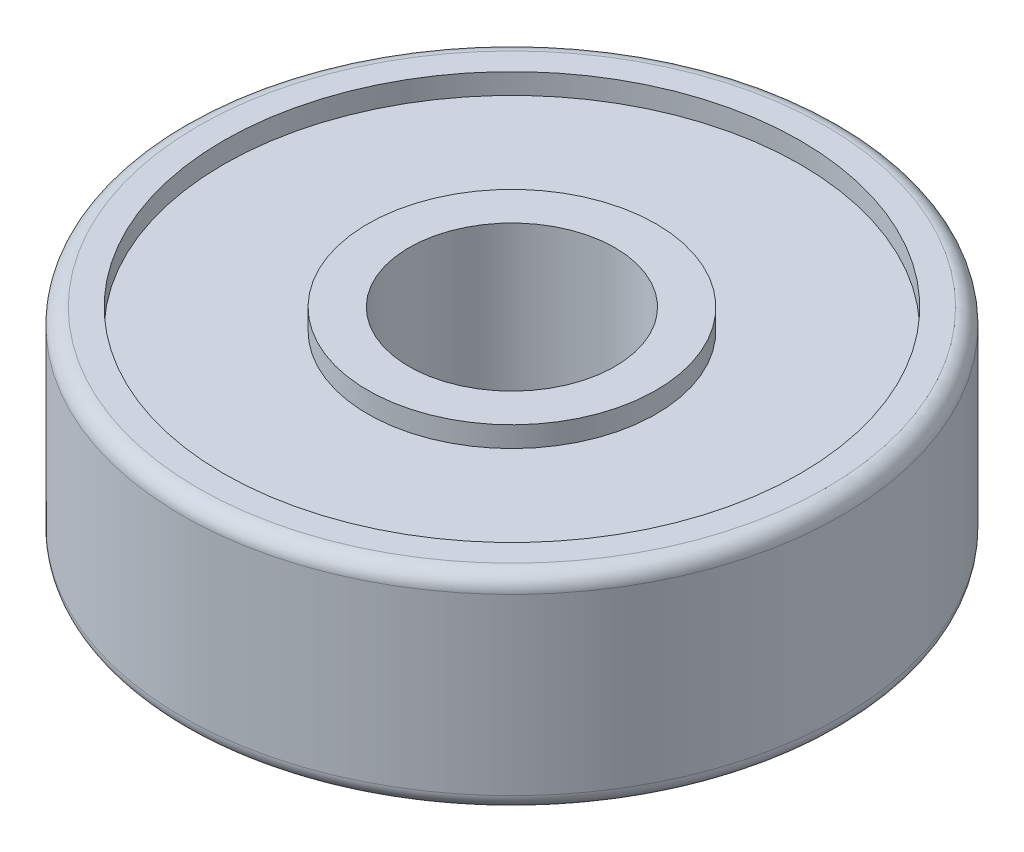
ISO-10303-21;
HEADER;
FILE_DESCRIPTION(('STEP AP214'),'2;1');
FILE_NAME('part.step','',(''),(''),'','','');
FILE_SCHEMA(('AUTOMOTIVE_DESIGN { 1 0 10303 214 1 1 1 1 }'));
ENDSEC;
DATA;
#1=APPLICATION_CONTEXT('core data for automotive mechanical design processes');
#2=APPLICATION_PROTOCOL_DEFINITION('international standard','automotive_design',2000,#1);
#3=PRODUCT_CONTEXT('',#1,'mechanical');
#4=PRODUCT('Part','Part','',(#3));
#5=PRODUCT_RELATED_PRODUCT_CATEGORY('part','',(#4));
#6=PRODUCT_DEFINITION_FORMATION('','',#4);
#7=PRODUCT_DEFINITION_CONTEXT('part definition',#1,'design');
#8=PRODUCT_DEFINITION('design','',#6,#7);
#9=PRODUCT_DEFINITION_SHAPE('','',#8);
#10=(LENGTH_UNIT() NAMED_UNIT(*) SI_UNIT(.MILLI.,.METRE.));
#11=(NAMED_UNIT(*) PLANE_ANGLE_UNIT() SI_UNIT($,.RADIAN.));
#12=(NAMED_UNIT(*) SI_UNIT($,.STERADIAN.) SOLID_ANGLE_UNIT());
#13=UNCERTAINTY_MEASURE_WITH_UNIT(LENGTH_MEASURE(1.E-05),#10,'distance_accuracy_value','');
#14=(GEOMETRIC_REPRESENTATION_CONTEXT(3) GLOBAL_UNCERTAINTY_ASSIGNED_CONTEXT((#13)) GLOBAL_UNIT_ASSIGNED_CONTEXT((#10,
#11,#12)) REPRESENTATION_CONTEXT('',''));
#15=CARTESIAN_POINT('',(0.,0.,0.));
#16=DIRECTION('',(0.,0.,1.));
#17=DIRECTION('',(1.,0.,0.));
#18=AXIS2_PLACEMENT_3D('',#15,#16,#17);
#19=CARTESIAN_POINT('',(0.,2.5,0.));
#20=DIRECTION('',(0.,-1.,0.));
#21=DIRECTION('',(0.,0.,-1.));
#22=AXIS2_PLACEMENT_3D('',#19,#20,#21);
#23=PLANE('',#22);
#24=CARTESIAN_POINT('',(0.,2.5,0.));
#25=DIRECTION('',(0.,-1.,0.));
#26=DIRECTION('',(0.,0.,-1.));
#27=AXIS2_PLACEMENT_3D('',#24,#25,#26);
#28=CIRCLE('',#27,7.);
#29=CARTESIAN_POINT('',(0.,2.5,-7.));
#30=VERTEX_POINT('',#29);
#31=EDGE_CURVE('E67',#30,#30,#28,.T.);
#32=ORIENTED_EDGE('',*,*,#31,.T.);
#33=EDGE_LOOP('',(#32));
#34=FACE_BOUND('',#33,.T.);
#35=CARTESIAN_POINT('',(0.,2.5,0.));
#36=DIRECTION('',(0.,-1.,0.));
#37=DIRECTION('',(1.,0.,0.));
#38=AXIS2_PLACEMENT_3D('',#35,#36,#37);
#39=CIRCLE('',#38,7.615);
#40=CARTESIAN_POINT('',(7.615,2.5,0.));
#41=VERTEX_POINT('',#40);
#42=CARTESIAN_POINT('',(0.,2.5,7.615));
#43=VERTEX_POINT('',#42);
#44=EDGE_CURVE('E52',#41,#43,#39,.T.);
#45=ORIENTED_EDGE('',*,*,#44,.F.);
#46=CARTESIAN_POINT('',(0.,2.5,0.));
#47=DIRECTION('',(0.,-1.,0.));
#48=DIRECTION('',(0.,0.,-1.));
#49=AXIS2_PLACEMENT_3D('',#46,#47,#48);
#50=CIRCLE('',#49,7.615);
#51=CARTESIAN_POINT('',(0.,2.5,-7.615));
#52=VERTEX_POINT('',#51);
#53=EDGE_CURVE('E55',#52,#41,#50,.T.);
#54=ORIENTED_EDGE('',*,*,#53,.F.);
#55=CARTESIAN_POINT('',(0.,2.5,0.));
#56=DIRECTION('',(0.,-1.,0.));
#57=DIRECTION('',(0.,0.,1.));
#58=AXIS2_PLACEMENT_3D('',#55,#56,#57);
#59=CIRCLE('',#58,7.615);
#60=EDGE_CURVE('E58',#43,#52,#59,.T.);
#61=ORIENTED_EDGE('',*,*,#60,.F.);
#62=EDGE_LOOP('',(#45,#54,#61));
#63=FACE_BOUND('',#62,.T.);
#64=ADVANCED_FACE('F17',(#34,#63),#23,.F.);
#65=CARTESIAN_POINT('',(0.,2.75,0.));
#66=DIRECTION('',(0.,-1.,0.));
#67=DIRECTION('',(0.,0.,-1.));
#68=AXIS2_PLACEMENT_3D('',#65,#66,#67);
#69=CYLINDRICAL_SURFACE('',#68,7.);
#70=CARTESIAN_POINT('',(0.,2.,0.));
#71=DIRECTION('',(0.,-1.,0.));
#72=DIRECTION('',(0.,0.,-1.));
#73=AXIS2_PLACEMENT_3D('',#70,#71,#72);
#74=CIRCLE('',#73,7.);
#75=CARTESIAN_POINT('',(0.,2.,-7.));
#76=VERTEX_POINT('',#75);
#77=EDGE_CURVE('E98',#76,#76,#74,.T.);
#78=ORIENTED_EDGE('',*,*,#77,.T.);
#79=EDGE_LOOP('',(#78));
#80=FACE_BOUND('',#79,.T.);
#81=ORIENTED_EDGE('',*,*,#31,.F.);
#82=EDGE_LOOP('',(#81));
#83=FACE_BOUND('',#82,.T.);
#84=ADVANCED_FACE('F87',(#80,#83),#69,.F.);
#85=CARTESIAN_POINT('',(0.,2.115,0.));
#86=DIRECTION('',(0.,-1.,0.));
#87=DIRECTION('',(0.,0.,-1.));
#88=AXIS2_PLACEMENT_3D('',#85,#86,#87);
#89=TOROIDAL_SURFACE('',#88,7.615,0.385);
#90=ORIENTED_EDGE('',*,*,#44,.T.);
#91=ORIENTED_EDGE('',*,*,#60,.T.);
#92=ORIENTED_EDGE('',*,*,#53,.T.);
#93=EDGE_LOOP('',(#90,#91,#92));
#94=FACE_BOUND('',#93,.T.);
#95=CARTESIAN_POINT('',(0.,2.115,0.));
#96=DIRECTION('',(0.,-1.,0.));
#97=DIRECTION('',(0.,0.,-1.));
#98=AXIS2_PLACEMENT_3D('',#95,#96,#97);
#99=CIRCLE('',#98,8.);
#100=CARTESIAN_POINT('',(0.,2.115,-8.));
#101=VERTEX_POINT('',#100);
#102=EDGE_CURVE('E95',#101,#101,#99,.T.);
#103=ORIENTED_EDGE('',*,*,#102,.F.);
#104=EDGE_LOOP('',(#103));
#105=FACE_BOUND('',#104,.T.);
#106=ADVANCED_FACE('F65',(#94,#105),#89,.T.);
#107=CARTESIAN_POINT('',(0.,2.,0.));
#108=DIRECTION('',(0.,-1.,0.));
#109=DIRECTION('',(0.,0.,-1.));
#110=AXIS2_PLACEMENT_3D('',#107,#108,#109);
#111=PLANE('',#110);
#112=CARTESIAN_POINT('',(0.,2.,0.));
#113=DIRECTION('',(0.,-1.,0.));
#114=DIRECTION('',(0.,0.,-1.));
#115=AXIS2_PLACEMENT_3D('',#112,#113,#114);
#116=CIRCLE('',#115,3.5);
#117=CARTESIAN_POINT('',(0.,2.,-3.5));
#118=VERTEX_POINT('',#117);
#119=EDGE_CURVE('E97',#118,#118,#116,.F.);
#120=ORIENTED_EDGE('',*,*,#119,.F.);
#121=EDGE_LOOP('',(#120));
#122=FACE_BOUND('',#121,.T.);
#123=ORIENTED_EDGE('',*,*,#77,.F.);
#124=EDGE_LOOP('',(#123));
#125=FACE_BOUND('',#124,.T.);
#126=ADVANCED_FACE('F86',(#122,#125),#111,.F.);
#127=CARTESIAN_POINT('',(0.,2.75,0.));
#128=DIRECTION('',(0.,-1.,0.));
#129=DIRECTION('',(0.,0.,-1.));
#130=AXIS2_PLACEMENT_3D('',#127,#128,#129);
#131=CYLINDRICAL_SURFACE('',#130,8.);
#132=CARTESIAN_POINT('',(0.,-2.115,0.));
#133=DIRECTION('',(0.,-1.,0.));
#134=DIRECTION('',(0.,0.,-1.));
#135=AXIS2_PLACEMENT_3D('',#132,#133,#134);
#136=CIRCLE('',#135,8.);
#137=CARTESIAN_POINT('',(0.,-2.115,-8.));
#138=VERTEX_POINT('',#137);
#139=EDGE_CURVE('E93',#138,#138,#136,.T.);
#140=ORIENTED_EDGE('',*,*,#139,.F.);
#141=EDGE_LOOP('',(#140));
#142=FACE_BOUND('',#141,.T.);
#143=ORIENTED_EDGE('',*,*,#102,.T.);
#144=EDGE_LOOP('',(#143));
#145=FACE_BOUND('',#144,.T.);
#146=ADVANCED_FACE('F201',(#142,#145),#131,.T.);
#147=CARTESIAN_POINT('',(0.,2.75,0.));
#148=DIRECTION('',(0.,-1.,0.));
#149=DIRECTION('',(0.,0.,-1.));
#150=AXIS2_PLACEMENT_3D('',#147,#148,#149);
#151=CYLINDRICAL_SURFACE('',#150,3.5);
#152=CARTESIAN_POINT('',(0.,2.5,0.));
#153=DIRECTION('',(0.,-1.,0.));
#154=DIRECTION('',(0.,0.,-1.));
#155=AXIS2_PLACEMENT_3D('',#152,#153,#154);
#156=CIRCLE('',#155,3.5);
#157=CARTESIAN_POINT('',(0.,2.5,-3.5));
#158=VERTEX_POINT('',#157);
#159=EDGE_CURVE('E193',#158,#158,#156,.T.);
#160=ORIENTED_EDGE('',*,*,#159,.T.);
#161=EDGE_LOOP('',(#160));
#162=FACE_BOUND('',#161,.T.);
#163=ORIENTED_EDGE('',*,*,#119,.T.);
#164=EDGE_LOOP('',(#163));
#165=FACE_BOUND('',#164,.T.);
#166=ADVANCED_FACE('F203',(#162,#165),#151,.T.);
#167=CARTESIAN_POINT('',(0.,2.5,0.));
#168=DIRECTION('',(0.,-1.,0.));
#169=DIRECTION('',(0.,0.,-1.));
#170=AXIS2_PLACEMENT_3D('',#167,#168,#169);
#171=PLANE('',#170);
#172=CARTESIAN_POINT('',(0.,2.5,0.));
#173=DIRECTION('',(0.,-1.,0.));
#174=DIRECTION('',(0.,0.,-1.));
#175=AXIS2_PLACEMENT_3D('',#172,#173,#174);
#176=CIRCLE('',#175,2.5);
#177=CARTESIAN_POINT('',(0.,2.5,-2.5));
#178=VERTEX_POINT('',#177);
#179=EDGE_CURVE('E117',#178,#178,#176,.T.);
#180=ORIENTED_EDGE('',*,*,#179,.T.);
#181=EDGE_LOOP('',(#180));
#182=FACE_BOUND('',#181,.T.);
#183=ORIENTED_EDGE('',*,*,#159,.F.);
#184=EDGE_LOOP('',(#183));
#185=FACE_BOUND('',#184,.T.);
#186=ADVANCED_FACE('F208',(#182,#185),#171,.F.);
#187=CARTESIAN_POINT('',(0.,-2.115,0.));
#188=DIRECTION('',(0.,-1.,0.));
#189=DIRECTION('',(0.,0.,-1.));
#190=AXIS2_PLACEMENT_3D('',#187,#188,#189);
#191=TOROIDAL_SURFACE('',#190,7.615,0.385);
#192=ORIENTED_EDGE('',*,*,#139,.T.);
#193=EDGE_LOOP('',(#192));
#194=FACE_BOUND('',#193,.T.);
#195=CARTESIAN_POINT('',(0.,-2.5,0.));
#196=DIRECTION('',(0.,1.,0.));
#197=DIRECTION('',(0.,0.,1.));
#198=AXIS2_PLACEMENT_3D('',#195,#196,#197);
#199=CIRCLE('',#198,7.615);
#200=CARTESIAN_POINT('',(7.615,-2.5,0.));
#201=VERTEX_POINT('',#200);
#202=CARTESIAN_POINT('',(0.,-2.5,7.615));
#203=VERTEX_POINT('',#202);
#204=EDGE_CURVE('E38',#201,#203,#199,.F.);
#205=ORIENTED_EDGE('',*,*,#204,.F.);
#206=CARTESIAN_POINT('',(0.,-2.5,0.));
#207=DIRECTION('',(0.,1.,0.));
#208=DIRECTION('',(1.,0.,0.));
#209=AXIS2_PLACEMENT_3D('',#206,#207,#208);
#210=CIRCLE('',#209,7.615);
#211=CARTESIAN_POINT('',(0.,-2.5,-7.615));
#212=VERTEX_POINT('',#211);
#213=EDGE_CURVE('E113',#212,#201,#210,.F.);
#214=ORIENTED_EDGE('',*,*,#213,.F.);
#215=CARTESIAN_POINT('',(0.,-2.5,0.));
#216=DIRECTION('',(0.,1.,0.));
#217=DIRECTION('',(0.,0.,-1.));
#218=AXIS2_PLACEMENT_3D('',#215,#216,#217);
#219=CIRCLE('',#218,7.615);
#220=EDGE_CURVE('E111',#203,#212,#219,.F.);
#221=ORIENTED_EDGE('',*,*,#220,.F.);
#222=EDGE_LOOP('',(#205,#214,#221));
#223=FACE_BOUND('',#222,.T.);
#224=ADVANCED_FACE('F112',(#194,#223),#191,.T.);
#225=CARTESIAN_POINT('',(0.,2.75,0.));
#226=DIRECTION('',(0.,-1.,0.));
#227=DIRECTION('',(0.,0.,-1.));
#228=AXIS2_PLACEMENT_3D('',#225,#226,#227);
#229=CYLINDRICAL_SURFACE('',#228,2.5);
#230=CARTESIAN_POINT('',(0.,-2.5,0.));
#231=DIRECTION('',(0.,-1.,0.));
#232=DIRECTION('',(0.,0.,-1.));
#233=AXIS2_PLACEMENT_3D('',#230,#231,#232);
#234=CIRCLE('',#233,2.5);
#235=CARTESIAN_POINT('',(0.,-2.5,-2.5));
#236=VERTEX_POINT('',#235);
#237=EDGE_CURVE('E121',#236,#236,#234,.F.);
#238=ORIENTED_EDGE('',*,*,#237,.F.);
#239=EDGE_LOOP('',(#238));
#240=FACE_BOUND('',#239,.T.);
#241=ORIENTED_EDGE('',*,*,#179,.F.);
#242=EDGE_LOOP('',(#241));
#243=FACE_BOUND('',#242,.T.);
#244=ADVANCED_FACE('F141',(#240,#243),#229,.F.);
#245=CARTESIAN_POINT('',(0.,-2.5,0.));
#246=DIRECTION('',(0.,-1.,0.));
#247=DIRECTION('',(0.,0.,-1.));
#248=AXIS2_PLACEMENT_3D('',#245,#246,#247);
#249=PLANE('',#248);
#250=CARTESIAN_POINT('',(0.,-2.5,0.));
#251=DIRECTION('',(0.,-1.,0.));
#252=DIRECTION('',(0.,0.,-1.));
#253=AXIS2_PLACEMENT_3D('',#250,#251,#252);
#254=CIRCLE('',#253,7.);
#255=CARTESIAN_POINT('',(0.,-2.5,-7.));
#256=VERTEX_POINT('',#255);
#257=EDGE_CURVE('E179',#256,#256,#254,.F.);
#258=ORIENTED_EDGE('',*,*,#257,.T.);
#259=EDGE_LOOP('',(#258));
#260=FACE_BOUND('',#259,.T.);
#261=ORIENTED_EDGE('',*,*,#213,.T.);
#262=ORIENTED_EDGE('',*,*,#204,.T.);
#263=ORIENTED_EDGE('',*,*,#220,.T.);
#264=EDGE_LOOP('',(#261,#262,#263));
#265=FACE_BOUND('',#264,.T.);
#266=ADVANCED_FACE('F119',(#260,#265),#249,.T.);
#267=CARTESIAN_POINT('',(0.,-2.5,0.));
#268=DIRECTION('',(0.,-1.,0.));
#269=DIRECTION('',(0.,0.,-1.));
#270=AXIS2_PLACEMENT_3D('',#267,#268,#269);
#271=PLANE('',#270);
#272=ORIENTED_EDGE('',*,*,#237,.T.);
#273=EDGE_LOOP('',(#272));
#274=FACE_BOUND('',#273,.T.);
#275=CARTESIAN_POINT('',(0.,-2.5,0.));
#276=DIRECTION('',(0.,-1.,0.));
#277=DIRECTION('',(0.,0.,-1.));
#278=AXIS2_PLACEMENT_3D('',#275,#276,#277);
#279=CIRCLE('',#278,3.5);
#280=CARTESIAN_POINT('',(0.,-2.5,-3.5));
#281=VERTEX_POINT('',#280);
#282=EDGE_CURVE('E183',#281,#281,#279,.F.);
#283=ORIENTED_EDGE('',*,*,#282,.F.);
#284=EDGE_LOOP('',(#283));
#285=FACE_BOUND('',#284,.T.);
#286=ADVANCED_FACE('F140',(#274,#285),#271,.T.);
#287=CARTESIAN_POINT('',(0.,2.75,0.));
#288=DIRECTION('',(0.,-1.,0.));
#289=DIRECTION('',(0.,0.,-1.));
#290=AXIS2_PLACEMENT_3D('',#287,#288,#289);
#291=CYLINDRICAL_SURFACE('',#290,7.);
#292=ORIENTED_EDGE('',*,*,#257,.F.);
#293=EDGE_LOOP('',(#292));
#294=FACE_BOUND('',#293,.T.);
#295=CARTESIAN_POINT('',(0.,-2.,0.));
#296=DIRECTION('',(0.,-1.,0.));
#297=DIRECTION('',(0.,0.,-1.));
#298=AXIS2_PLACEMENT_3D('',#295,#296,#297);
#299=CIRCLE('',#298,7.);
#300=CARTESIAN_POINT('',(0.,-2.,-7.));
#301=VERTEX_POINT('',#300);
#302=EDGE_CURVE('E29',#301,#301,#299,.T.);
#303=ORIENTED_EDGE('',*,*,#302,.F.);
#304=EDGE_LOOP('',(#303));
#305=FACE_BOUND('',#304,.T.);
#306=ADVANCED_FACE('F167',(#294,#305),#291,.F.);
#307=CARTESIAN_POINT('',(0.,2.75,0.));
#308=DIRECTION('',(0.,-1.,0.));
#309=DIRECTION('',(0.,0.,-1.));
#310=AXIS2_PLACEMENT_3D('',#307,#308,#309);
#311=CYLINDRICAL_SURFACE('',#310,3.5);
#312=CARTESIAN_POINT('',(0.,-2.,0.));
#313=DIRECTION('',(0.,-1.,0.));
#314=DIRECTION('',(0.,0.,-1.));
#315=AXIS2_PLACEMENT_3D('',#312,#313,#314);
#316=CIRCLE('',#315,3.5);
#317=CARTESIAN_POINT('',(0.,-2.,-3.5));
#318=VERTEX_POINT('',#317);
#319=EDGE_CURVE('E11',#318,#318,#316,.F.);
#320=ORIENTED_EDGE('',*,*,#319,.F.);
#321=EDGE_LOOP('',(#320));
#322=FACE_BOUND('',#321,.T.);
#323=ORIENTED_EDGE('',*,*,#282,.T.);
#324=EDGE_LOOP('',(#323));
#325=FACE_BOUND('',#324,.T.);
#326=ADVANCED_FACE('F164',(#322,#325),#311,.T.);
#327=CARTESIAN_POINT('',(0.,-2.,0.));
#328=DIRECTION('',(0.,-1.,0.));
#329=DIRECTION('',(0.,0.,-1.));
#330=AXIS2_PLACEMENT_3D('',#327,#328,#329);
#331=PLANE('',#330);
#332=ORIENTED_EDGE('',*,*,#319,.T.);
#333=EDGE_LOOP('',(#332));
#334=FACE_BOUND('',#333,.T.);
#335=ORIENTED_EDGE('',*,*,#302,.T.);
#336=EDGE_LOOP('',(#335));
#337=FACE_BOUND('',#336,.T.);
#338=ADVANCED_FACE('F161',(#334,#337),#331,.T.);
#339=CLOSED_SHELL('',(#64,#84,#106,#126,#146,#166,#186,#224,#244,#266,#286,#306,#326,#338));
#340=CARTESIAN_POINT('',(0.,0.,0.));
#341=DIRECTION('',(0.,-1.,0.));
#342=DIRECTION('',(0.,0.,-1.));
#343=AXIS2_PLACEMENT_3D('',#340,#341,#342);
#344=TOROIDAL_SURFACE('',#343,5.2,1.75);
#345=ADVANCED_FACE('F157',(),#344,.F.);
#346=CLOSED_SHELL('',(#345));
#347=ORIENTED_CLOSED_SHELL('',*,#346,.T.);
#348=BREP_WITH_VOIDS('B1',#339,(#347));
#349=ADVANCED_BREP_SHAPE_REPRESENTATION('',(#18,#348),#14);
#350=SHAPE_DEFINITION_REPRESENTATION(#9,#349);
ENDSEC;
END-ISO-10303-21;
